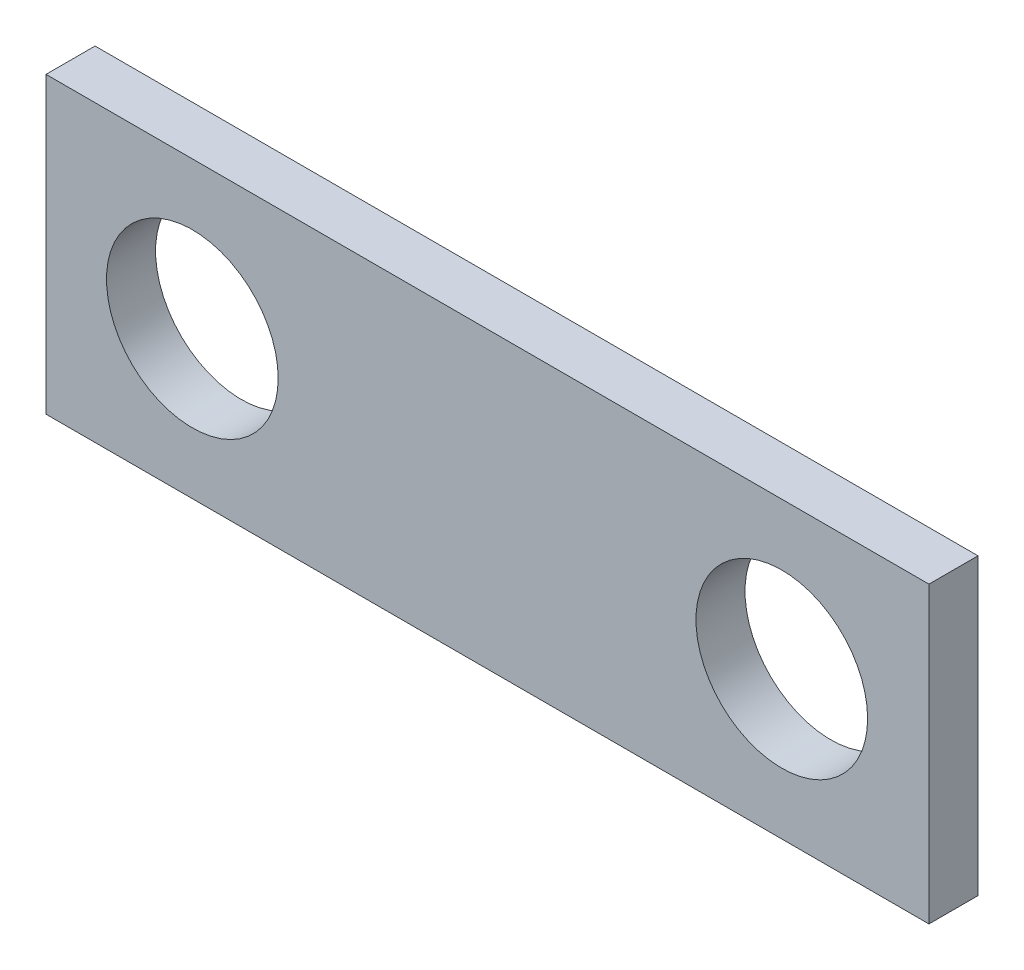
ISO-10303-21;
HEADER;
FILE_DESCRIPTION(('STEP AP214'),'2;1');
FILE_NAME('part.step','',(''),(''),'','','');
FILE_SCHEMA(('AUTOMOTIVE_DESIGN { 1 0 10303 214 1 1 1 1 }'));
ENDSEC;
DATA;
#1=APPLICATION_CONTEXT('core data for automotive mechanical design processes');
#2=APPLICATION_PROTOCOL_DEFINITION('international standard','automotive_design',2000,#1);
#3=PRODUCT_CONTEXT('',#1,'mechanical');
#4=PRODUCT('Part','Part','',(#3));
#5=PRODUCT_RELATED_PRODUCT_CATEGORY('part','',(#4));
#6=PRODUCT_DEFINITION_FORMATION('','',#4);
#7=PRODUCT_DEFINITION_CONTEXT('part definition',#1,'design');
#8=PRODUCT_DEFINITION('design','',#6,#7);
#9=PRODUCT_DEFINITION_SHAPE('','',#8);
#10=(LENGTH_UNIT() NAMED_UNIT(*) SI_UNIT(.MILLI.,.METRE.));
#11=(NAMED_UNIT(*) PLANE_ANGLE_UNIT() SI_UNIT($,.RADIAN.));
#12=(NAMED_UNIT(*) SI_UNIT($,.STERADIAN.) SOLID_ANGLE_UNIT());
#13=UNCERTAINTY_MEASURE_WITH_UNIT(LENGTH_MEASURE(1.E-05),#10,'distance_accuracy_value','');
#14=(GEOMETRIC_REPRESENTATION_CONTEXT(3) GLOBAL_UNCERTAINTY_ASSIGNED_CONTEXT((#13)) GLOBAL_UNIT_ASSIGNED_CONTEXT((#10,
#11,#12)) REPRESENTATION_CONTEXT('',''));
#15=CARTESIAN_POINT('',(0.,0.,0.));
#16=DIRECTION('',(0.,0.,1.));
#17=DIRECTION('',(1.,0.,0.));
#18=AXIS2_PLACEMENT_3D('',#15,#16,#17);
#19=CARTESIAN_POINT('',(57.15,-19.05,6.35));
#20=DIRECTION('',(-1.,0.,0.));
#21=DIRECTION('',(0.,0.,1.));
#22=AXIS2_PLACEMENT_3D('',#19,#20,#21);
#23=PLANE('',#22);
#24=DIRECTION('',(0.,1.,0.));
#25=VECTOR('',#24,1.);
#26=CARTESIAN_POINT('',(57.15,-19.05,0.));
#27=LINE('',#26,#25);
#28=CARTESIAN_POINT('',(57.15,-19.05,0.));
#29=VERTEX_POINT('',#28);
#30=CARTESIAN_POINT('',(57.15,19.05,0.));
#31=VERTEX_POINT('',#30);
#32=EDGE_CURVE('E96',#29,#31,#27,.T.);
#33=ORIENTED_EDGE('',*,*,#32,.T.);
#34=DIRECTION('',(0.,0.,-1.));
#35=VECTOR('',#34,1.);
#36=CARTESIAN_POINT('',(57.15,19.05,6.35));
#37=LINE('',#36,#35);
#38=CARTESIAN_POINT('',(57.15,19.05,6.35));
#39=VERTEX_POINT('',#38);
#40=EDGE_CURVE('E11',#39,#31,#37,.T.);
#41=ORIENTED_EDGE('',*,*,#40,.F.);
#42=DIRECTION('',(0.,1.,0.));
#43=VECTOR('',#42,1.);
#44=CARTESIAN_POINT('',(57.15,-19.05,6.35));
#45=LINE('',#44,#43);
#46=CARTESIAN_POINT('',(57.15,-19.05,6.35));
#47=VERTEX_POINT('',#46);
#48=EDGE_CURVE('E84',#47,#39,#45,.T.);
#49=ORIENTED_EDGE('',*,*,#48,.F.);
#50=DIRECTION('',(0.,0.,-1.));
#51=VECTOR('',#50,1.);
#52=CARTESIAN_POINT('',(57.15,-19.05,6.35));
#53=LINE('',#52,#51);
#54=EDGE_CURVE('E92',#47,#29,#53,.T.);
#55=ORIENTED_EDGE('',*,*,#54,.T.);
#56=EDGE_LOOP('',(#33,#41,#49,#55));
#57=FACE_BOUND('',#56,.T.);
#58=ADVANCED_FACE('F33',(#57),#23,.F.);
#59=CARTESIAN_POINT('',(-57.15,19.05,6.35));
#60=DIRECTION('',(0.,-1.,0.));
#61=DIRECTION('',(0.,0.,-1.));
#62=AXIS2_PLACEMENT_3D('',#59,#60,#61);
#63=PLANE('',#62);
#64=DIRECTION('',(-1.,0.,0.));
#65=VECTOR('',#64,1.);
#66=CARTESIAN_POINT('',(-57.15,19.05,0.));
#67=LINE('',#66,#65);
#68=CARTESIAN_POINT('',(-57.15,19.05,0.));
#69=VERTEX_POINT('',#68);
#70=EDGE_CURVE('E88',#31,#69,#67,.T.);
#71=ORIENTED_EDGE('',*,*,#70,.T.);
#72=DIRECTION('',(0.,0.,-1.));
#73=VECTOR('',#72,1.);
#74=CARTESIAN_POINT('',(-57.15,19.05,6.35));
#75=LINE('',#74,#73);
#76=CARTESIAN_POINT('',(-57.15,19.05,6.35));
#77=VERTEX_POINT('',#76);
#78=EDGE_CURVE('E41',#77,#69,#75,.T.);
#79=ORIENTED_EDGE('',*,*,#78,.F.);
#80=DIRECTION('',(-1.,0.,0.));
#81=VECTOR('',#80,1.);
#82=CARTESIAN_POINT('',(-57.15,19.05,6.35));
#83=LINE('',#82,#81);
#84=EDGE_CURVE('E79',#39,#77,#83,.T.);
#85=ORIENTED_EDGE('',*,*,#84,.F.);
#86=ORIENTED_EDGE('',*,*,#40,.T.);
#87=EDGE_LOOP('',(#71,#79,#85,#86));
#88=FACE_BOUND('',#87,.T.);
#89=ADVANCED_FACE('F87',(#88),#63,.F.);
#90=CARTESIAN_POINT('',(-57.15,-19.05,6.35));
#91=DIRECTION('',(1.,0.,0.));
#92=DIRECTION('',(0.,0.,-1.));
#93=AXIS2_PLACEMENT_3D('',#90,#91,#92);
#94=PLANE('',#93);
#95=DIRECTION('',(0.,-1.,0.));
#96=VECTOR('',#95,1.);
#97=CARTESIAN_POINT('',(-57.15,-19.05,0.));
#98=LINE('',#97,#96);
#99=CARTESIAN_POINT('',(-57.15,-19.05,0.));
#100=VERTEX_POINT('',#99);
#101=EDGE_CURVE('E66',#69,#100,#98,.T.);
#102=ORIENTED_EDGE('',*,*,#101,.T.);
#103=DIRECTION('',(0.,0.,-1.));
#104=VECTOR('',#103,1.);
#105=CARTESIAN_POINT('',(-57.15,-19.05,6.35));
#106=LINE('',#105,#104);
#107=CARTESIAN_POINT('',(-57.15,-19.05,6.35));
#108=VERTEX_POINT('',#107);
#109=EDGE_CURVE('E89',#108,#100,#106,.T.);
#110=ORIENTED_EDGE('',*,*,#109,.F.);
#111=DIRECTION('',(0.,-1.,0.));
#112=VECTOR('',#111,1.);
#113=CARTESIAN_POINT('',(-57.15,-19.05,6.35));
#114=LINE('',#113,#112);
#115=EDGE_CURVE('E82',#77,#108,#114,.T.);
#116=ORIENTED_EDGE('',*,*,#115,.F.);
#117=ORIENTED_EDGE('',*,*,#78,.T.);
#118=EDGE_LOOP('',(#102,#110,#116,#117));
#119=FACE_BOUND('',#118,.T.);
#120=ADVANCED_FACE('F90',(#119),#94,.F.);
#121=CARTESIAN_POINT('',(-57.15,-19.05,6.35));
#122=DIRECTION('',(0.,1.,0.));
#123=DIRECTION('',(0.,0.,1.));
#124=AXIS2_PLACEMENT_3D('',#121,#122,#123);
#125=PLANE('',#124);
#126=DIRECTION('',(1.,0.,0.));
#127=VECTOR('',#126,1.);
#128=CARTESIAN_POINT('',(-57.15,-19.05,0.));
#129=LINE('',#128,#127);
#130=EDGE_CURVE('E72',#100,#29,#129,.T.);
#131=ORIENTED_EDGE('',*,*,#130,.T.);
#132=ORIENTED_EDGE('',*,*,#54,.F.);
#133=DIRECTION('',(1.,0.,0.));
#134=VECTOR('',#133,1.);
#135=CARTESIAN_POINT('',(-57.15,-19.05,6.35));
#136=LINE('',#135,#134);
#137=EDGE_CURVE('E49',#108,#47,#136,.T.);
#138=ORIENTED_EDGE('',*,*,#137,.F.);
#139=ORIENTED_EDGE('',*,*,#109,.T.);
#140=EDGE_LOOP('',(#131,#132,#138,#139));
#141=FACE_BOUND('',#140,.T.);
#142=ADVANCED_FACE('F104',(#141),#125,.F.);
#143=CARTESIAN_POINT('',(0.,0.,6.35));
#144=DIRECTION('',(0.,0.,-1.));
#145=DIRECTION('',(-1.,0.,0.));
#146=AXIS2_PLACEMENT_3D('',#143,#144,#145);
#147=PLANE('',#146);
#148=CARTESIAN_POINT('',(38.1,0.,6.35));
#149=DIRECTION('',(0.,0.,1.));
#150=DIRECTION('',(1.,0.,0.));
#151=AXIS2_PLACEMENT_3D('',#148,#149,#150);
#152=CIRCLE('',#151,11.1125);
#153=CARTESIAN_POINT('',(49.2125,0.,6.35));
#154=VERTEX_POINT('',#153);
#155=EDGE_CURVE('E116',#154,#154,#152,.T.);
#156=ORIENTED_EDGE('',*,*,#155,.F.);
#157=EDGE_LOOP('',(#156));
#158=FACE_BOUND('',#157,.T.);
#159=CARTESIAN_POINT('',(-38.2053218738634,0.,6.35));
#160=DIRECTION('',(0.,0.,1.));
#161=DIRECTION('',(1.,0.,0.));
#162=AXIS2_PLACEMENT_3D('',#159,#160,#161);
#163=CIRCLE('',#162,11.1125);
#164=CARTESIAN_POINT('',(-27.0928218738634,0.,6.35));
#165=VERTEX_POINT('',#164);
#166=EDGE_CURVE('E110',#165,#165,#163,.T.);
#167=ORIENTED_EDGE('',*,*,#166,.F.);
#168=EDGE_LOOP('',(#167));
#169=FACE_BOUND('',#168,.T.);
#170=ORIENTED_EDGE('',*,*,#48,.T.);
#171=ORIENTED_EDGE('',*,*,#84,.T.);
#172=ORIENTED_EDGE('',*,*,#115,.T.);
#173=ORIENTED_EDGE('',*,*,#137,.T.);
#174=EDGE_LOOP('',(#170,#171,#172,#173));
#175=FACE_BOUND('',#174,.T.);
#176=ADVANCED_FACE('F80',(#158,#169,#175),#147,.F.);
#177=CARTESIAN_POINT('',(0.,0.,0.));
#178=DIRECTION('',(0.,0.,-1.));
#179=DIRECTION('',(-1.,0.,0.));
#180=AXIS2_PLACEMENT_3D('',#177,#178,#179);
#181=PLANE('',#180);
#182=CARTESIAN_POINT('',(38.1,0.,0.));
#183=DIRECTION('',(0.,0.,1.));
#184=DIRECTION('',(1.,0.,0.));
#185=AXIS2_PLACEMENT_3D('',#182,#183,#184);
#186=CIRCLE('',#185,11.1125);
#187=CARTESIAN_POINT('',(49.2125,0.,0.));
#188=VERTEX_POINT('',#187);
#189=EDGE_CURVE('E113',#188,#188,#186,.T.);
#190=ORIENTED_EDGE('',*,*,#189,.T.);
#191=EDGE_LOOP('',(#190));
#192=FACE_BOUND('',#191,.T.);
#193=CARTESIAN_POINT('',(-38.2053218738634,0.,0.));
#194=DIRECTION('',(0.,0.,1.));
#195=DIRECTION('',(1.,0.,0.));
#196=AXIS2_PLACEMENT_3D('',#193,#194,#195);
#197=CIRCLE('',#196,11.1125);
#198=CARTESIAN_POINT('',(-27.0928218738634,0.,0.));
#199=VERTEX_POINT('',#198);
#200=EDGE_CURVE('E99',#199,#199,#197,.T.);
#201=ORIENTED_EDGE('',*,*,#200,.T.);
#202=EDGE_LOOP('',(#201));
#203=FACE_BOUND('',#202,.T.);
#204=ORIENTED_EDGE('',*,*,#32,.F.);
#205=ORIENTED_EDGE('',*,*,#130,.F.);
#206=ORIENTED_EDGE('',*,*,#101,.F.);
#207=ORIENTED_EDGE('',*,*,#70,.F.);
#208=EDGE_LOOP('',(#204,#205,#206,#207));
#209=FACE_BOUND('',#208,.T.);
#210=ADVANCED_FACE('F107',(#192,#203,#209),#181,.T.);
#211=CARTESIAN_POINT('',(-38.2053218738634,0.,0.));
#212=DIRECTION('',(0.,0.,1.));
#213=DIRECTION('',(1.,0.,0.));
#214=AXIS2_PLACEMENT_3D('',#211,#212,#213);
#215=CYLINDRICAL_SURFACE('',#214,11.1125);
#216=ORIENTED_EDGE('',*,*,#200,.F.);
#217=EDGE_LOOP('',(#216));
#218=FACE_BOUND('',#217,.T.);
#219=ORIENTED_EDGE('',*,*,#166,.T.);
#220=EDGE_LOOP('',(#219));
#221=FACE_BOUND('',#220,.T.);
#222=ADVANCED_FACE('F127',(#218,#221),#215,.F.);
#223=CARTESIAN_POINT('',(38.1,0.,0.));
#224=DIRECTION('',(0.,0.,1.));
#225=DIRECTION('',(1.,0.,0.));
#226=AXIS2_PLACEMENT_3D('',#223,#224,#225);
#227=CYLINDRICAL_SURFACE('',#226,11.1125);
#228=ORIENTED_EDGE('',*,*,#189,.F.);
#229=EDGE_LOOP('',(#228));
#230=FACE_BOUND('',#229,.T.);
#231=ORIENTED_EDGE('',*,*,#155,.T.);
#232=EDGE_LOOP('',(#231));
#233=FACE_BOUND('',#232,.T.);
#234=ADVANCED_FACE('F124',(#230,#233),#227,.F.);
#235=CLOSED_SHELL('',(#58,#89,#120,#142,#176,#210,#222,#234));
#236=MANIFOLD_SOLID_BREP('B2',#235);
#237=ADVANCED_BREP_SHAPE_REPRESENTATION('',(#18,#236),#14);
#238=SHAPE_DEFINITION_REPRESENTATION(#9,#237);
ENDSEC;
END-ISO-10303-21;
